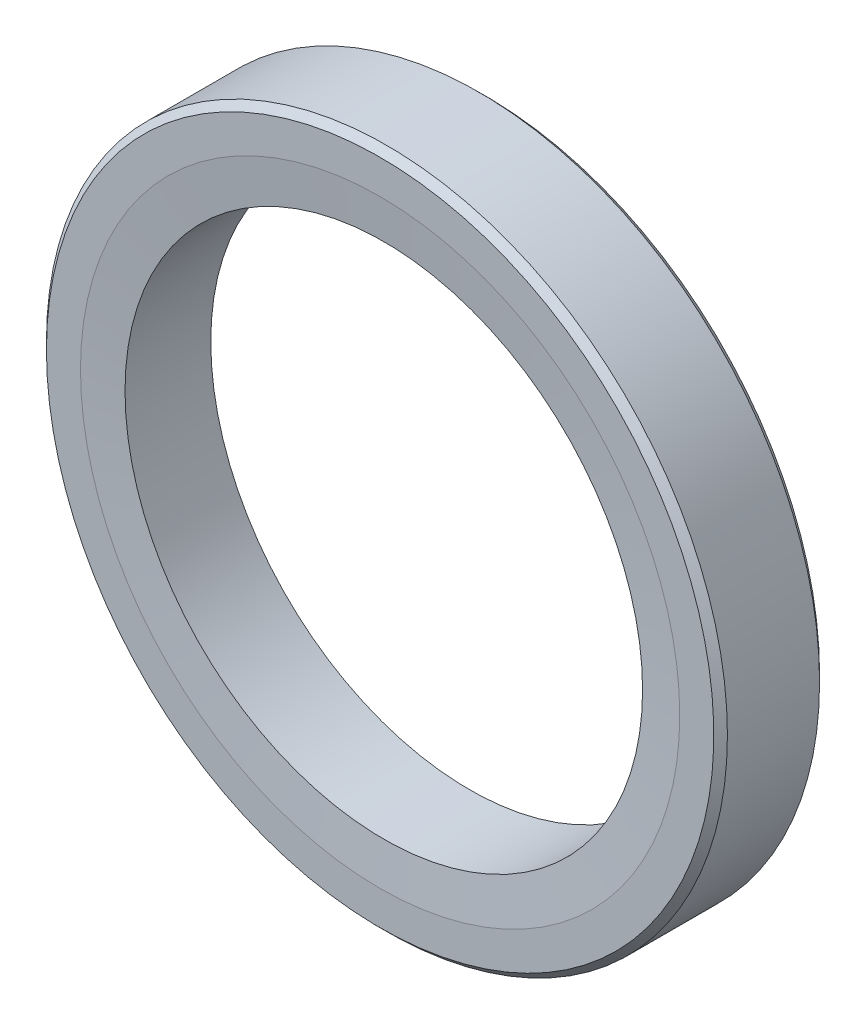
ISO-10303-21;
HEADER;
FILE_DESCRIPTION(('STEP AP214'),'2;1');
FILE_NAME('part.step','',(''),(''),'','','');
FILE_SCHEMA(('AUTOMOTIVE_DESIGN { 1 0 10303 214 1 1 1 1 }'));
ENDSEC;
DATA;
#1=APPLICATION_CONTEXT('core data for automotive mechanical design processes');
#2=APPLICATION_PROTOCOL_DEFINITION('international standard','automotive_design',2000,#1);
#3=PRODUCT_CONTEXT('',#1,'mechanical');
#4=PRODUCT('Part','Part','',(#3));
#5=PRODUCT_RELATED_PRODUCT_CATEGORY('part','',(#4));
#6=PRODUCT_DEFINITION_FORMATION('','',#4);
#7=PRODUCT_DEFINITION_CONTEXT('part definition',#1,'design');
#8=PRODUCT_DEFINITION('design','',#6,#7);
#9=PRODUCT_DEFINITION_SHAPE('','',#8);
#10=(LENGTH_UNIT() NAMED_UNIT(*) SI_UNIT(.MILLI.,.METRE.));
#11=(NAMED_UNIT(*) PLANE_ANGLE_UNIT() SI_UNIT($,.RADIAN.));
#12=(NAMED_UNIT(*) SI_UNIT($,.STERADIAN.) SOLID_ANGLE_UNIT());
#13=UNCERTAINTY_MEASURE_WITH_UNIT(LENGTH_MEASURE(1.E-05),#10,'distance_accuracy_value','');
#14=(GEOMETRIC_REPRESENTATION_CONTEXT(3) GLOBAL_UNCERTAINTY_ASSIGNED_CONTEXT((#13)) GLOBAL_UNIT_ASSIGNED_CONTEXT((#10,
#11,#12)) REPRESENTATION_CONTEXT('',''));
#15=CARTESIAN_POINT('',(0.,0.,0.));
#16=DIRECTION('',(0.,0.,1.));
#17=DIRECTION('',(1.,0.,0.));
#18=AXIS2_PLACEMENT_3D('',#15,#16,#17);
#19=CARTESIAN_POINT('',(0.,25.,3.88315));
#20=DIRECTION('',(0.,0.,-1.));
#21=DIRECTION('',(-1.,0.,0.));
#22=AXIS2_PLACEMENT_3D('',#19,#20,#21);
#23=PLANE('',#22);
#24=CARTESIAN_POINT('',(0.,0.,3.88315));
#25=DIRECTION('',(0.,0.,-1.));
#26=DIRECTION('',(-1.,0.,0.));
#27=AXIS2_PLACEMENT_3D('',#24,#25,#26);
#28=CIRCLE('',#27,24.5);
#29=CARTESIAN_POINT('',(-24.5,0.,3.88315));
#30=VERTEX_POINT('',#29);
#31=EDGE_CURVE('E10',#30,#30,#28,.F.);
#32=ORIENTED_EDGE('',*,*,#31,.T.);
#33=EDGE_LOOP('',(#32));
#34=FACE_BOUND('',#33,.T.);
#35=CARTESIAN_POINT('',(0.,0.,3.88315));
#36=DIRECTION('',(0.,0.,1.));
#37=DIRECTION('',(1.,0.,0.));
#38=AXIS2_PLACEMENT_3D('',#35,#36,#37);
#39=CIRCLE('',#38,22.);
#40=CARTESIAN_POINT('',(22.,0.,3.88315));
#41=VERTEX_POINT('',#40);
#42=EDGE_CURVE('E60',#41,#41,#39,.T.);
#43=ORIENTED_EDGE('',*,*,#42,.F.);
#44=EDGE_LOOP('',(#43));
#45=FACE_BOUND('',#44,.T.);
#46=ADVANCED_FACE('F34',(#34,#45),#23,.F.);
#47=CARTESIAN_POINT('',(0.,0.,3.88315));
#48=DIRECTION('',(0.,0.,1.));
#49=DIRECTION('',(1.,0.,0.));
#50=AXIS2_PLACEMENT_3D('',#47,#48,#49);
#51=CONICAL_SURFACE('',#50,22.,1.48090281630125);
#52=CARTESIAN_POINT('',(0.,0.,3.61274069742881));
#53=DIRECTION('',(0.,0.,1.));
#54=DIRECTION('',(1.,0.,0.));
#55=AXIS2_PLACEMENT_3D('',#52,#53,#54);
#56=CIRCLE('',#55,19.);
#57=CARTESIAN_POINT('',(19.,0.,3.61274069742881));
#58=VERTEX_POINT('',#57);
#59=EDGE_CURVE('E63',#58,#58,#56,.T.);
#60=ORIENTED_EDGE('',*,*,#59,.F.);
#61=EDGE_LOOP('',(#60));
#62=FACE_BOUND('',#61,.T.);
#63=ORIENTED_EDGE('',*,*,#42,.T.);
#64=EDGE_LOOP('',(#63));
#65=FACE_BOUND('',#64,.T.);
#66=ADVANCED_FACE('F86',(#62,#65),#51,.F.);
#67=CARTESIAN_POINT('',(0.,0.,4.95));
#68=DIRECTION('',(0.,0.,1.));
#69=DIRECTION('',(1.,0.,0.));
#70=AXIS2_PLACEMENT_3D('',#67,#68,#69);
#71=CYLINDRICAL_SURFACE('',#70,19.);
#72=CARTESIAN_POINT('',(0.,0.,-2.68260530721657));
#73=DIRECTION('',(0.,0.,1.));
#74=DIRECTION('',(1.,0.,0.));
#75=AXIS2_PLACEMENT_3D('',#72,#73,#74);
#76=CIRCLE('',#75,19.);
#77=CARTESIAN_POINT('',(19.,0.,-2.68260530721657));
#78=VERTEX_POINT('',#77);
#79=EDGE_CURVE('E67',#78,#78,#76,.T.);
#80=ORIENTED_EDGE('',*,*,#79,.F.);
#81=EDGE_LOOP('',(#80));
#82=FACE_BOUND('',#81,.T.);
#83=ORIENTED_EDGE('',*,*,#59,.T.);
#84=EDGE_LOOP('',(#83));
#85=FACE_BOUND('',#84,.T.);
#86=ADVANCED_FACE('F80',(#82,#85),#71,.F.);
#87=CARTESIAN_POINT('',(0.,0.,-2.68260530721657));
#88=DIRECTION('',(0.,0.,-1.));
#89=DIRECTION('',(-1.,0.,0.));
#90=AXIS2_PLACEMENT_3D('',#87,#88,#89);
#91=CONICAL_SURFACE('',#90,19.,1.19013343856793);
#92=CARTESIAN_POINT('',(0.,0.,-3.88315));
#93=DIRECTION('',(0.,0.,1.));
#94=DIRECTION('',(1.,0.,0.));
#95=AXIS2_PLACEMENT_3D('',#92,#93,#94);
#96=CIRCLE('',#95,22.);
#97=CARTESIAN_POINT('',(22.,0.,-3.88315));
#98=VERTEX_POINT('',#97);
#99=EDGE_CURVE('E70',#98,#98,#96,.T.);
#100=ORIENTED_EDGE('',*,*,#99,.F.);
#101=EDGE_LOOP('',(#100));
#102=FACE_BOUND('',#101,.T.);
#103=ORIENTED_EDGE('',*,*,#79,.T.);
#104=EDGE_LOOP('',(#103));
#105=FACE_BOUND('',#104,.T.);
#106=ADVANCED_FACE('F77',(#102,#105),#91,.F.);
#107=CARTESIAN_POINT('',(0.,25.,-3.88315));
#108=DIRECTION('',(0.,0.,1.));
#109=DIRECTION('',(1.,0.,0.));
#110=AXIS2_PLACEMENT_3D('',#107,#108,#109);
#111=PLANE('',#110);
#112=CARTESIAN_POINT('',(0.,0.,-3.88315));
#113=DIRECTION('',(0.,0.,1.));
#114=DIRECTION('',(1.,0.,0.));
#115=AXIS2_PLACEMENT_3D('',#112,#113,#114);
#116=CIRCLE('',#115,24.5);
#117=CARTESIAN_POINT('',(24.5,0.,-3.88315));
#118=VERTEX_POINT('',#117);
#119=EDGE_CURVE('E42',#118,#118,#116,.F.);
#120=ORIENTED_EDGE('',*,*,#119,.T.);
#121=EDGE_LOOP('',(#120));
#122=FACE_BOUND('',#121,.T.);
#123=ORIENTED_EDGE('',*,*,#99,.T.);
#124=EDGE_LOOP('',(#123));
#125=FACE_BOUND('',#124,.T.);
#126=ADVANCED_FACE('F75',(#122,#125),#111,.F.);
#127=CARTESIAN_POINT('',(0.,0.,4.95));
#128=DIRECTION('',(0.,0.,1.));
#129=DIRECTION('',(1.,0.,0.));
#130=AXIS2_PLACEMENT_3D('',#127,#128,#129);
#131=CYLINDRICAL_SURFACE('',#130,25.);
#132=CARTESIAN_POINT('',(0.,0.,-3.38315));
#133=DIRECTION('',(0.,0.,1.));
#134=DIRECTION('',(1.,0.,0.));
#135=AXIS2_PLACEMENT_3D('',#132,#133,#134);
#136=CIRCLE('',#135,25.);
#137=CARTESIAN_POINT('',(25.,0.,-3.38315));
#138=VERTEX_POINT('',#137);
#139=EDGE_CURVE('E48',#138,#138,#136,.T.);
#140=ORIENTED_EDGE('',*,*,#139,.T.);
#141=EDGE_LOOP('',(#140));
#142=FACE_BOUND('',#141,.T.);
#143=CARTESIAN_POINT('',(0.,0.,3.38314999999999));
#144=DIRECTION('',(0.,0.,-1.));
#145=DIRECTION('',(-1.,0.,0.));
#146=AXIS2_PLACEMENT_3D('',#143,#144,#145);
#147=CIRCLE('',#146,25.);
#148=CARTESIAN_POINT('',(-25.,0.,3.38314999999999));
#149=VERTEX_POINT('',#148);
#150=EDGE_CURVE('E54',#149,#149,#147,.T.);
#151=ORIENTED_EDGE('',*,*,#150,.T.);
#152=EDGE_LOOP('',(#151));
#153=FACE_BOUND('',#152,.T.);
#154=ADVANCED_FACE('F101',(#142,#153),#131,.T.);
#155=CARTESIAN_POINT('',(0.,0.,-3.38315));
#156=DIRECTION('',(0.,0.,1.));
#157=DIRECTION('',(1.,0.,0.));
#158=AXIS2_PLACEMENT_3D('',#155,#156,#157);
#159=CONICAL_SURFACE('',#158,25.,0.785398163397452);
#160=ORIENTED_EDGE('',*,*,#119,.F.);
#161=EDGE_LOOP('',(#160));
#162=FACE_BOUND('',#161,.T.);
#163=ORIENTED_EDGE('',*,*,#139,.F.);
#164=EDGE_LOOP('',(#163));
#165=FACE_BOUND('',#164,.T.);
#166=ADVANCED_FACE('F99',(#162,#165),#159,.T.);
#167=CARTESIAN_POINT('',(0.,0.,3.88315));
#168=DIRECTION('',(0.,0.,-1.));
#169=DIRECTION('',(-1.,0.,0.));
#170=AXIS2_PLACEMENT_3D('',#167,#168,#169);
#171=CONICAL_SURFACE('',#170,24.5,0.785398163397438);
#172=ORIENTED_EDGE('',*,*,#150,.F.);
#173=EDGE_LOOP('',(#172));
#174=FACE_BOUND('',#173,.T.);
#175=ORIENTED_EDGE('',*,*,#31,.F.);
#176=EDGE_LOOP('',(#175));
#177=FACE_BOUND('',#176,.T.);
#178=ADVANCED_FACE('F36',(#174,#177),#171,.T.);
#179=CLOSED_SHELL('',(#46,#66,#86,#106,#126,#154,#166,#178));
#180=MANIFOLD_SOLID_BREP('B2',#179);
#181=ADVANCED_BREP_SHAPE_REPRESENTATION('',(#18,#180),#14);
#182=SHAPE_DEFINITION_REPRESENTATION(#9,#181);
ENDSEC;
END-ISO-10303-21;
